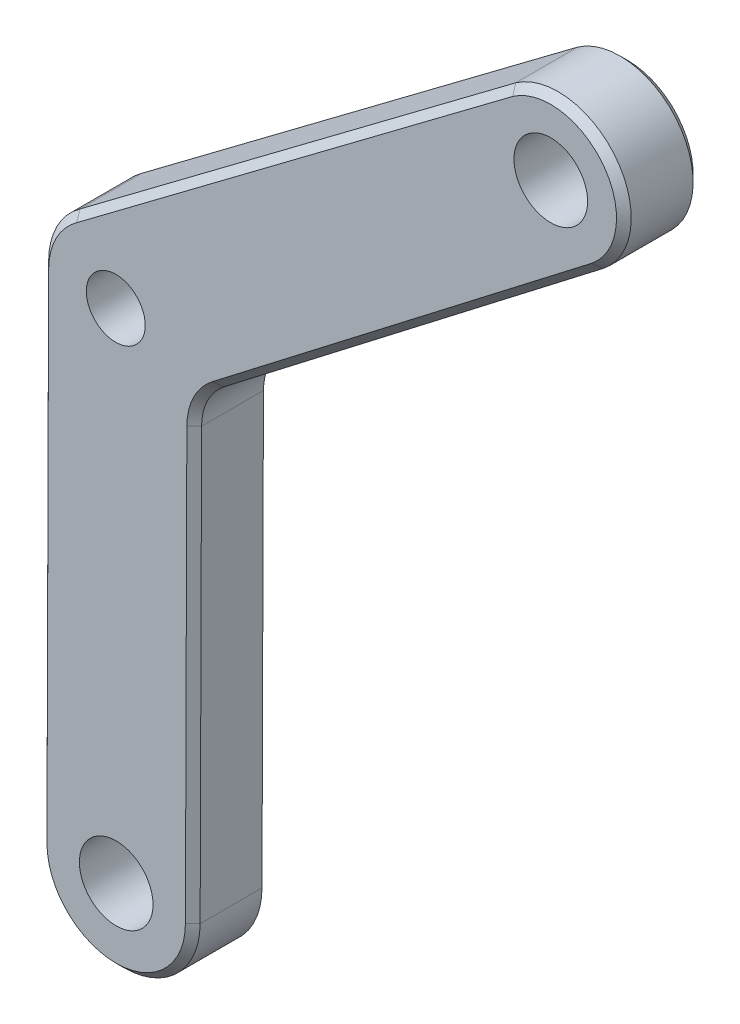
ISO-10303-21;
HEADER;
FILE_DESCRIPTION(('STEP AP214'),'2;1');
FILE_NAME('part.step','',(''),(''),'','','');
FILE_SCHEMA(('AUTOMOTIVE_DESIGN { 1 0 10303 214 1 1 1 1 }'));
ENDSEC;
DATA;
#1=APPLICATION_CONTEXT('core data for automotive mechanical design processes');
#2=APPLICATION_PROTOCOL_DEFINITION('international standard','automotive_design',2000,#1);
#3=PRODUCT_CONTEXT('',#1,'mechanical');
#4=PRODUCT('Part','Part','',(#3));
#5=PRODUCT_RELATED_PRODUCT_CATEGORY('part','',(#4));
#6=PRODUCT_DEFINITION_FORMATION('','',#4);
#7=PRODUCT_DEFINITION_CONTEXT('part definition',#1,'design');
#8=PRODUCT_DEFINITION('design','',#6,#7);
#9=PRODUCT_DEFINITION_SHAPE('','',#8);
#10=(LENGTH_UNIT() NAMED_UNIT(*) SI_UNIT(.MILLI.,.METRE.));
#11=(NAMED_UNIT(*) PLANE_ANGLE_UNIT() SI_UNIT($,.RADIAN.));
#12=(NAMED_UNIT(*) SI_UNIT($,.STERADIAN.) SOLID_ANGLE_UNIT());
#13=UNCERTAINTY_MEASURE_WITH_UNIT(LENGTH_MEASURE(1.E-05),#10,'distance_accuracy_value','');
#14=(GEOMETRIC_REPRESENTATION_CONTEXT(3) GLOBAL_UNCERTAINTY_ASSIGNED_CONTEXT((#13)) GLOBAL_UNIT_ASSIGNED_CONTEXT((#10,
#11,#12)) REPRESENTATION_CONTEXT('',''));
#15=CARTESIAN_POINT('',(0.,0.,0.));
#16=DIRECTION('',(0.,0.,1.));
#17=DIRECTION('',(1.,0.,0.));
#18=AXIS2_PLACEMENT_3D('',#15,#16,#17);
#19=CARTESIAN_POINT('',(22.3710335125583,42.3687079252575,8.3));
#20=DIRECTION('',(0.,0.,-1.));
#21=DIRECTION('',(-1.,0.,0.));
#22=AXIS2_PLACEMENT_3D('',#19,#20,#21);
#23=CYLINDRICAL_SURFACE('',#22,5.05840666229587);
#24=DIRECTION('',(0.,0.,-1.));
#25=VECTOR('',#24,1.);
#26=CARTESIAN_POINT('',(19.4307995829492,46.484835037038,8.3));
#27=LINE('',#26,#25);
#28=CARTESIAN_POINT('',(19.4307995829492,46.484835037038,10.4));
#29=VERTEX_POINT('',#28);
#30=CARTESIAN_POINT('',(19.4307995829492,46.484835037038,6.19999999999999));
#31=VERTEX_POINT('',#30);
#32=EDGE_CURVE('E167',#29,#31,#27,.T.);
#33=ORIENTED_EDGE('',*,*,#32,.T.);
#34=CARTESIAN_POINT('',(22.3710335125583,42.3687079252575,6.19999999999999));
#35=DIRECTION('',(0.,0.,1.));
#36=DIRECTION('',(1.,0.,0.));
#37=AXIS2_PLACEMENT_3D('',#34,#35,#36);
#38=CIRCLE('',#37,5.05840666229587);
#39=CARTESIAN_POINT('',(17.3126566700705,42.3860768786516,6.19999999999999));
#40=VERTEX_POINT('',#39);
#41=EDGE_CURVE('E174',#31,#40,#38,.T.);
#42=ORIENTED_EDGE('',*,*,#41,.T.);
#43=DIRECTION('',(0.,0.,-1.));
#44=VECTOR('',#43,1.);
#45=CARTESIAN_POINT('',(17.3126566700705,42.3860768786516,8.3));
#46=LINE('',#45,#44);
#47=CARTESIAN_POINT('',(17.3126566700705,42.3860768786516,10.4));
#48=VERTEX_POINT('',#47);
#49=EDGE_CURVE('E460',#48,#40,#46,.T.);
#50=ORIENTED_EDGE('',*,*,#49,.F.);
#51=CARTESIAN_POINT('',(22.3710335125583,42.3687079252575,10.4));
#52=DIRECTION('',(0.,0.,1.));
#53=DIRECTION('',(1.,0.,0.));
#54=AXIS2_PLACEMENT_3D('',#51,#52,#53);
#55=CIRCLE('',#54,5.05840666229587);
#56=EDGE_CURVE('E394',#48,#29,#55,.F.);
#57=ORIENTED_EDGE('',*,*,#56,.T.);
#58=EDGE_LOOP('',(#33,#42,#50,#57));
#59=FACE_BOUND('',#58,.T.);
#60=ADVANCED_FACE('F47',(#59),#23,.T.);
#61=CARTESIAN_POINT('',(17.1997578432109,8.5860768786516,8.3));
#62=DIRECTION('',(-0.999994421572052,0.00334018334501582,0.));
#63=DIRECTION('',(-0.00334018334501582,-0.999994421572052,0.));
#64=AXIS2_PLACEMENT_3D('',#61,#62,#63);
#65=PLANE('',#64);
#66=ORIENTED_EDGE('',*,*,#49,.T.);
#67=DIRECTION('',(-0.00334018334501582,-0.999994421572052,0.));
#68=VECTOR('',#67,1.);
#69=CARTESIAN_POINT('',(17.1997578432109,8.5860768786516,6.19999999999999));
#70=LINE('',#69,#68);
#71=CARTESIAN_POINT('',(17.1997578432109,8.5860768786516,6.19999999999999));
#72=VERTEX_POINT('',#71);
#73=EDGE_CURVE('E397',#40,#72,#70,.T.);
#74=ORIENTED_EDGE('',*,*,#73,.T.);
#75=DIRECTION('',(0.,0.,-1.));
#76=VECTOR('',#75,1.);
#77=CARTESIAN_POINT('',(17.1997578432109,8.5860768786516,8.3));
#78=LINE('',#77,#76);
#79=CARTESIAN_POINT('',(17.1997578432109,8.5860768786516,10.4));
#80=VERTEX_POINT('',#79);
#81=EDGE_CURVE('E464',#80,#72,#78,.T.);
#82=ORIENTED_EDGE('',*,*,#81,.F.);
#83=DIRECTION('',(0.00334018334501582,0.999994421572052,0.));
#84=VECTOR('',#83,1.);
#85=CARTESIAN_POINT('',(17.1997578432109,8.5860768786516,10.4));
#86=LINE('',#85,#84);
#87=EDGE_CURVE('E400',#80,#48,#86,.T.);
#88=ORIENTED_EDGE('',*,*,#87,.T.);
#89=EDGE_LOOP('',(#66,#74,#82,#88));
#90=FACE_BOUND('',#89,.T.);
#91=ADVANCED_FACE('F508',(#90),#65,.T.);
#92=CARTESIAN_POINT('',(22.3997288353856,8.56870792525752,8.3));
#93=DIRECTION('',(0.,0.,-1.));
#94=DIRECTION('',(-1.,0.,0.));
#95=AXIS2_PLACEMENT_3D('',#92,#93,#94);
#96=CYLINDRICAL_SURFACE('',#95,5.2);
#97=ORIENTED_EDGE('',*,*,#81,.T.);
#98=CARTESIAN_POINT('',(22.3997288353856,8.56870792525752,6.19999999999999));
#99=DIRECTION('',(0.,0.,1.));
#100=DIRECTION('',(1.,0.,0.));
#101=AXIS2_PLACEMENT_3D('',#98,#99,#100);
#102=CIRCLE('',#101,5.2);
#103=CARTESIAN_POINT('',(27.5996998275603,8.55133897186343,6.19999999999999));
#104=VERTEX_POINT('',#103);
#105=EDGE_CURVE('E403',#72,#104,#102,.T.);
#106=ORIENTED_EDGE('',*,*,#105,.T.);
#107=DIRECTION('',(0.,0.,-1.));
#108=VECTOR('',#107,1.);
#109=CARTESIAN_POINT('',(27.5996998275603,8.55133897186343,8.3));
#110=LINE('',#109,#108);
#111=CARTESIAN_POINT('',(27.5996998275603,8.55133897186343,10.4));
#112=VERTEX_POINT('',#111);
#113=EDGE_CURVE('E468',#112,#104,#110,.T.);
#114=ORIENTED_EDGE('',*,*,#113,.F.);
#115=CARTESIAN_POINT('',(22.3997288353856,8.56870792525752,10.4));
#116=DIRECTION('',(0.,0.,1.));
#117=DIRECTION('',(1.,0.,0.));
#118=AXIS2_PLACEMENT_3D('',#115,#116,#117);
#119=CIRCLE('',#118,5.2);
#120=EDGE_CURVE('E406',#112,#80,#119,.F.);
#121=ORIENTED_EDGE('',*,*,#120,.T.);
#122=EDGE_LOOP('',(#97,#106,#114,#121));
#123=FACE_BOUND('',#122,.T.);
#124=ADVANCED_FACE('F511',(#123),#96,.T.);
#125=CARTESIAN_POINT('',(27.5996998275603,8.55133897186344,8.3));
#126=DIRECTION('',(-0.999994421572052,0.0033401833450153,0.));
#127=DIRECTION('',(-0.0033401833450153,-0.999994421572052,0.));
#128=AXIS2_PLACEMENT_3D('',#125,#126,#127);
#129=PLANE('',#128);
#130=ORIENTED_EDGE('',*,*,#113,.T.);
#131=DIRECTION('',(0.0033401833450153,0.999994421572052,0.));
#132=VECTOR('',#131,1.);
#133=CARTESIAN_POINT('',(27.5996998275603,8.55133897186344,6.19999999999999));
#134=LINE('',#133,#132);
#135=CARTESIAN_POINT('',(27.697556883774,37.8480871492451,6.19999999999999));
#136=VERTEX_POINT('',#135);
#137=EDGE_CURVE('E409',#104,#136,#134,.T.);
#138=ORIENTED_EDGE('',*,*,#137,.T.);
#139=DIRECTION('',(0.,0.,-1.));
#140=VECTOR('',#139,1.);
#141=CARTESIAN_POINT('',(27.697556883774,37.8480871492451,8.3));
#142=LINE('',#141,#140);
#143=CARTESIAN_POINT('',(27.697556883774,37.8480871492451,10.4));
#144=VERTEX_POINT('',#143);
#145=EDGE_CURVE('E197',#136,#144,#142,.F.);
#146=ORIENTED_EDGE('',*,*,#145,.T.);
#147=DIRECTION('',(-0.0033401833450153,-0.999994421572052,0.));
#148=VECTOR('',#147,1.);
#149=CARTESIAN_POINT('',(27.5996998275603,8.55133897186343,10.4));
#150=LINE('',#149,#148);
#151=EDGE_CURVE('E412',#144,#112,#150,.T.);
#152=ORIENTED_EDGE('',*,*,#151,.T.);
#153=EDGE_LOOP('',(#130,#138,#146,#152));
#154=FACE_BOUND('',#153,.T.);
#155=ADVANCED_FACE('F560',(#154),#129,.F.);
#156=CARTESIAN_POINT('',(27.7039388137063,39.7587290727537,8.3));
#157=DIRECTION('',(-0.610243962001282,0.792213548761304,0.));
#158=DIRECTION('',(-0.792213548761304,-0.610243962001282,0.));
#159=AXIS2_PLACEMENT_3D('',#156,#157,#158);
#160=PLANE('',#159);
#161=DIRECTION('',(0.,0.,-1.));
#162=VECTOR('',#161,1.);
#163=CARTESIAN_POINT('',(29.2175836761,40.9246932743687,5.7));
#164=LINE('',#163,#162);
#165=CARTESIAN_POINT('',(29.2175836761,40.9246932743687,10.4));
#166=VERTEX_POINT('',#165);
#167=CARTESIAN_POINT('',(29.2175836761,40.9246932743687,6.19999999999999));
#168=VERTEX_POINT('',#167);
#169=EDGE_CURVE('E456',#166,#168,#164,.T.);
#170=ORIENTED_EDGE('',*,*,#169,.T.);
#171=DIRECTION('',(0.792213548761304,0.610243962001282,0.));
#172=VECTOR('',#171,1.);
#173=CARTESIAN_POINT('',(27.7039388137063,39.7587290727537,6.19999999999999));
#174=LINE('',#173,#172);
#175=CARTESIAN_POINT('',(54.9605801074899,60.7545840413713,6.19999999999999));
#176=VERTEX_POINT('',#175);
#177=EDGE_CURVE('E421',#168,#176,#174,.T.);
#178=ORIENTED_EDGE('',*,*,#177,.T.);
#179=DIRECTION('',(0.,0.,-1.));
#180=VECTOR('',#179,1.);
#181=CARTESIAN_POINT('',(54.9605801074899,60.7545840413713,8.3));
#182=LINE('',#181,#180);
#183=CARTESIAN_POINT('',(54.9605801074899,60.7545840413713,10.4));
#184=VERTEX_POINT('',#183);
#185=EDGE_CURVE('E187',#184,#176,#182,.T.);
#186=ORIENTED_EDGE('',*,*,#185,.F.);
#187=DIRECTION('',(-0.792213548761304,-0.610243962001282,0.));
#188=VECTOR('',#187,1.);
#189=CARTESIAN_POINT('',(29.2175836761,40.9246932743687,10.4));
#190=LINE('',#189,#188);
#191=EDGE_CURVE('E424',#184,#166,#190,.T.);
#192=ORIENTED_EDGE('',*,*,#191,.T.);
#193=EDGE_LOOP('',(#170,#178,#186,#192));
#194=FACE_BOUND('',#193,.T.);
#195=ADVANCED_FACE('F562',(#194),#160,.F.);
#196=CARTESIAN_POINT('',(51.905731419017,64.6640367315511,8.3));
#197=DIRECTION('',(0.,0.,-1.));
#198=DIRECTION('',(-1.,0.,0.));
#199=AXIS2_PLACEMENT_3D('',#196,#197,#198);
#200=CYLINDRICAL_SURFACE('',#199,4.96144342366393);
#201=ORIENTED_EDGE('',*,*,#185,.T.);
#202=CARTESIAN_POINT('',(51.905731419017,64.6640367315511,6.19999999999999));
#203=DIRECTION('',(0.,0.,1.));
#204=DIRECTION('',(1.,0.,0.));
#205=AXIS2_PLACEMENT_3D('',#202,#203,#204);
#206=CIRCLE('',#205,4.96144342366393);
#207=CARTESIAN_POINT('',(49.0247776501373,68.7033468493553,6.19999999999999));
#208=VERTEX_POINT('',#207);
#209=EDGE_CURVE('E185',#176,#208,#206,.T.);
#210=ORIENTED_EDGE('',*,*,#209,.T.);
#211=DIRECTION('',(0.,0.,-1.));
#212=VECTOR('',#211,1.);
#213=CARTESIAN_POINT('',(49.0247776501373,68.7033468493553,8.3));
#214=LINE('',#213,#212);
#215=CARTESIAN_POINT('',(49.0247776501373,68.7033468493553,10.4));
#216=VERTEX_POINT('',#215);
#217=EDGE_CURVE('E165',#216,#208,#214,.T.);
#218=ORIENTED_EDGE('',*,*,#217,.F.);
#219=CARTESIAN_POINT('',(51.905731419017,64.6640367315511,10.4));
#220=DIRECTION('',(0.,0.,1.));
#221=DIRECTION('',(1.,0.,0.));
#222=AXIS2_PLACEMENT_3D('',#219,#220,#221);
#223=CIRCLE('',#222,4.96144342366393);
#224=EDGE_CURVE('E182',#216,#184,#223,.F.);
#225=ORIENTED_EDGE('',*,*,#224,.T.);
#226=EDGE_LOOP('',(#201,#210,#218,#225));
#227=FACE_BOUND('',#226,.T.);
#228=ADVANCED_FACE('F181',(#227),#200,.T.);
#229=CARTESIAN_POINT('',(19.4307995829492,46.484835037038,8.3));
#230=DIRECTION('',(-0.600398184595808,0.799701206660374,0.));
#231=DIRECTION('',(-0.799701206660374,-0.600398184595808,0.));
#232=AXIS2_PLACEMENT_3D('',#229,#230,#231);
#233=PLANE('',#232);
#234=ORIENTED_EDGE('',*,*,#217,.T.);
#235=DIRECTION('',(-0.799701206660374,-0.600398184595808,0.));
#236=VECTOR('',#235,1.);
#237=CARTESIAN_POINT('',(19.4307995829492,46.484835037038,6.19999999999999));
#238=LINE('',#237,#236);
#239=EDGE_CURVE('E173',#208,#31,#238,.T.);
#240=ORIENTED_EDGE('',*,*,#239,.T.);
#241=ORIENTED_EDGE('',*,*,#32,.F.);
#242=DIRECTION('',(0.799701206660374,0.600398184595808,0.));
#243=VECTOR('',#242,1.);
#244=CARTESIAN_POINT('',(19.4307995829492,46.484835037038,10.4));
#245=LINE('',#244,#243);
#246=EDGE_CURVE('E162',#29,#216,#245,.T.);
#247=ORIENTED_EDGE('',*,*,#246,.T.);
#248=EDGE_LOOP('',(#234,#240,#241,#247));
#249=FACE_BOUND('',#248,.T.);
#250=ADVANCED_FACE('F164',(#249),#233,.T.);
#251=CARTESIAN_POINT('',(22.3710335125583,42.3687079252575,10.9));
#252=DIRECTION('',(0.,0.,1.));
#253=DIRECTION('',(1.,0.,0.));
#254=AXIS2_PLACEMENT_3D('',#251,#252,#253);
#255=PLANE('',#254);
#256=DIRECTION('',(0.792213548761304,0.610243962001282,0.));
#257=VECTOR('',#256,1.);
#258=CARTESIAN_POINT('',(54.6554581264893,61.150690815752,10.9));
#259=LINE('',#258,#257);
#260=CARTESIAN_POINT('',(28.9124616950994,41.3208000487493,10.9));
#261=VERTEX_POINT('',#260);
#262=CARTESIAN_POINT('',(54.6540495764378,61.1496058063307,10.9));
#263=VERTEX_POINT('',#262);
#264=EDGE_CURVE('E57',#261,#263,#259,.T.);
#265=ORIENTED_EDGE('',*,*,#264,.T.);
#266=CARTESIAN_POINT('',(51.905731419017,64.6640367315511,10.9));
#267=DIRECTION('',(0.,0.,1.));
#268=DIRECTION('',(1.,0.,0.));
#269=AXIS2_PLACEMENT_3D('',#266,#267,#268);
#270=CIRCLE('',#269,4.46144342366393);
#271=CARTESIAN_POINT('',(49.3199586401439,68.2997287645199,10.9));
#272=VERTEX_POINT('',#271);
#273=EDGE_CURVE('E12',#263,#272,#270,.T.);
#274=ORIENTED_EDGE('',*,*,#273,.T.);
#275=DIRECTION('',(-0.799701206660374,-0.600398184595808,0.));
#276=VECTOR('',#275,1.);
#277=CARTESIAN_POINT('',(19.6350292331419,46.0129326744549,10.9));
#278=LINE('',#277,#276);
#279=CARTESIAN_POINT('',(19.7261315203818,46.0813302802304,10.9));
#280=VERTEX_POINT('',#279);
#281=EDGE_CURVE('E200',#272,#280,#278,.T.);
#282=ORIENTED_EDGE('',*,*,#281,.T.);
#283=CARTESIAN_POINT('',(22.3710335125583,42.3687079252575,10.9));
#284=DIRECTION('',(0.,0.,1.));
#285=DIRECTION('',(1.,0.,0.));
#286=AXIS2_PLACEMENT_3D('',#283,#284,#285);
#287=CIRCLE('',#286,4.55840666229587);
#288=CARTESIAN_POINT('',(17.8126538832817,42.3844067869707,10.9));
#289=VERTEX_POINT('',#288);
#290=EDGE_CURVE('E387',#280,#289,#287,.T.);
#291=ORIENTED_EDGE('',*,*,#290,.T.);
#292=DIRECTION('',(-0.00334018334501582,-0.999994421572051,0.));
#293=VECTOR('',#292,1.);
#294=CARTESIAN_POINT('',(17.8126523011154,42.3839338391969,10.9));
#295=LINE('',#294,#293);
#296=CARTESIAN_POINT('',(17.699755053997,8.58440678697909,10.9));
#297=VERTEX_POINT('',#296);
#298=EDGE_CURVE('E384',#289,#297,#295,.T.);
#299=ORIENTED_EDGE('',*,*,#298,.T.);
#300=CARTESIAN_POINT('',(22.3997288353856,8.56870792525752,10.9));
#301=DIRECTION('',(0.,0.,1.));
#302=DIRECTION('',(1.,0.,0.));
#303=AXIS2_PLACEMENT_3D('',#300,#301,#302);
#304=CIRCLE('',#303,4.7);
#305=CARTESIAN_POINT('',(27.0997026167743,8.55300906353594,10.9));
#306=VERTEX_POINT('',#305);
#307=EDGE_CURVE('E381',#297,#306,#304,.T.);
#308=ORIENTED_EDGE('',*,*,#307,.T.);
#309=DIRECTION('',(0.0033401833450153,0.999994421572051,0.));
#310=VECTOR('',#309,1.);
#311=CARTESIAN_POINT('',(27.197559672988,37.8497572409176,10.9));
#312=LINE('',#311,#310);
#313=CARTESIAN_POINT('',(27.197559672988,37.8497572409176,10.9));
#314=VERTEX_POINT('',#313);
#315=EDGE_CURVE('E378',#306,#314,#312,.T.);
#316=ORIENTED_EDGE('',*,*,#315,.T.);
#317=CARTESIAN_POINT('',(31.597535127905,37.8350604341996,10.9));
#318=DIRECTION('',(0.,0.,1.));
#319=DIRECTION('',(1.,0.,0.));
#320=AXIS2_PLACEMENT_3D('',#317,#318,#319);
#321=CIRCLE('',#320,4.4);
#322=EDGE_CURVE('E68',#314,#261,#321,.F.);
#323=ORIENTED_EDGE('',*,*,#322,.T.);
#324=EDGE_LOOP('',(#265,#274,#282,#291,#299,#308,#316,#323));
#325=FACE_BOUND('',#324,.T.);
#326=CARTESIAN_POINT('',(22.3710335125583,42.3687079252575,10.9));
#327=DIRECTION('',(0.,0.,1.));
#328=DIRECTION('',(1.,0.,0.));
#329=AXIS2_PLACEMENT_3D('',#326,#327,#328);
#330=CIRCLE('',#329,2.);
#331=CARTESIAN_POINT('',(24.3710335125583,42.3687079252575,10.9));
#332=VERTEX_POINT('',#331);
#333=EDGE_CURVE('E51',#332,#332,#330,.T.);
#334=ORIENTED_EDGE('',*,*,#333,.F.);
#335=EDGE_LOOP('',(#334));
#336=FACE_BOUND('',#335,.T.);
#337=CARTESIAN_POINT('',(22.3997288353856,8.56870792525752,10.9));
#338=DIRECTION('',(0.,0.,1.));
#339=DIRECTION('',(1.,0.,0.));
#340=AXIS2_PLACEMENT_3D('',#337,#338,#339);
#341=CIRCLE('',#340,2.5);
#342=CARTESIAN_POINT('',(24.8997288353856,8.56870792525752,10.9));
#343=VERTEX_POINT('',#342);
#344=EDGE_CURVE('E281',#343,#343,#341,.T.);
#345=ORIENTED_EDGE('',*,*,#344,.F.);
#346=EDGE_LOOP('',(#345));
#347=FACE_BOUND('',#346,.T.);
#348=CARTESIAN_POINT('',(51.905731419017,64.6640367315511,10.9));
#349=DIRECTION('',(0.,0.,1.));
#350=DIRECTION('',(1.,0.,0.));
#351=AXIS2_PLACEMENT_3D('',#348,#349,#350);
#352=CIRCLE('',#351,2.50000000000001);
#353=CARTESIAN_POINT('',(54.405731419017,64.6640367315511,10.9));
#354=VERTEX_POINT('',#353);
#355=EDGE_CURVE('E289',#354,#354,#352,.T.);
#356=ORIENTED_EDGE('',*,*,#355,.F.);
#357=EDGE_LOOP('',(#356));
#358=FACE_BOUND('',#357,.T.);
#359=ADVANCED_FACE('F365',(#325,#336,#347,#358),#255,.T.);
#360=CARTESIAN_POINT('',(22.3710335125583,42.3687079252575,5.7));
#361=DIRECTION('',(0.,0.,1.));
#362=DIRECTION('',(1.,0.,0.));
#363=AXIS2_PLACEMENT_3D('',#360,#361,#362);
#364=PLANE('',#363);
#365=DIRECTION('',(0.799701206660374,0.600398184595808,0.));
#366=VECTOR('',#365,1.);
#367=CARTESIAN_POINT('',(49.3249767424352,68.3034962460251,5.7));
#368=LINE('',#367,#366);
#369=CARTESIAN_POINT('',(19.7261315203821,46.0813302802306,5.7));
#370=VERTEX_POINT('',#369);
#371=CARTESIAN_POINT('',(49.319958640144,68.29972876452,5.7));
#372=VERTEX_POINT('',#371);
#373=EDGE_CURVE('E449',#370,#372,#368,.T.);
#374=ORIENTED_EDGE('',*,*,#373,.T.);
#375=CARTESIAN_POINT('',(51.905731419017,64.6640367315511,5.7));
#376=DIRECTION('',(0.,0.,1.));
#377=DIRECTION('',(1.,0.,0.));
#378=AXIS2_PLACEMENT_3D('',#375,#376,#377);
#379=CIRCLE('',#378,4.46144342366394);
#380=CARTESIAN_POINT('',(54.654049576438,61.1496058063308,5.7));
#381=VERTEX_POINT('',#380);
#382=EDGE_CURVE('E427',#372,#381,#379,.F.);
#383=ORIENTED_EDGE('',*,*,#382,.T.);
#384=DIRECTION('',(-0.792213548761304,-0.610243962001282,0.));
#385=VECTOR('',#384,1.);
#386=CARTESIAN_POINT('',(25.3136505656106,38.5486273617415,5.7));
#387=LINE('',#386,#385);
#388=CARTESIAN_POINT('',(28.9124616950994,41.3208000487493,5.7));
#389=VERTEX_POINT('',#388);
#390=EDGE_CURVE('E431',#381,#389,#387,.T.);
#391=ORIENTED_EDGE('',*,*,#390,.T.);
#392=CARTESIAN_POINT('',(31.597535127905,37.8350604341996,5.7));
#393=DIRECTION('',(0.,0.,1.));
#394=DIRECTION('',(1.,0.,0.));
#395=AXIS2_PLACEMENT_3D('',#392,#393,#394);
#396=CIRCLE('',#395,4.39999999999998);
#397=CARTESIAN_POINT('',(27.197559672988,37.8497572409176,5.7));
#398=VERTEX_POINT('',#397);
#399=EDGE_CURVE('E434',#389,#398,#396,.T.);
#400=ORIENTED_EDGE('',*,*,#399,.T.);
#401=DIRECTION('',(-0.0033401833450153,-0.999994421572051,0.));
#402=VECTOR('',#401,1.);
#403=CARTESIAN_POINT('',(27.2125998638926,42.3525361157537,5.7));
#404=LINE('',#403,#402);
#405=CARTESIAN_POINT('',(27.0997026167743,8.55300906353594,5.7));
#406=VERTEX_POINT('',#405);
#407=EDGE_CURVE('E437',#398,#406,#404,.T.);
#408=ORIENTED_EDGE('',*,*,#407,.T.);
#409=CARTESIAN_POINT('',(22.3997288353856,8.56870792525752,5.7));
#410=DIRECTION('',(0.,0.,1.));
#411=DIRECTION('',(1.,0.,0.));
#412=AXIS2_PLACEMENT_3D('',#409,#410,#411);
#413=CIRCLE('',#412,4.70000000000001);
#414=CARTESIAN_POINT('',(17.699755053997,8.58440678697909,5.7));
#415=VERTEX_POINT('',#414);
#416=EDGE_CURVE('E440',#406,#415,#413,.F.);
#417=ORIENTED_EDGE('',*,*,#416,.T.);
#418=DIRECTION('',(0.00334018334501582,0.999994421572051,0.));
#419=VECTOR('',#418,1.);
#420=CARTESIAN_POINT('',(17.8126538808565,42.3844067869791,5.7));
#421=LINE('',#420,#419);
#422=CARTESIAN_POINT('',(17.8126538832816,42.3844067869707,5.7));
#423=VERTEX_POINT('',#422);
#424=EDGE_CURVE('E443',#415,#423,#421,.T.);
#425=ORIENTED_EDGE('',*,*,#424,.T.);
#426=CARTESIAN_POINT('',(22.3710335125583,42.3687079252575,5.7));
#427=DIRECTION('',(0.,0.,1.));
#428=DIRECTION('',(1.,0.,0.));
#429=AXIS2_PLACEMENT_3D('',#426,#427,#428);
#430=CIRCLE('',#429,4.55840666229589);
#431=EDGE_CURVE('E446',#423,#370,#430,.F.);
#432=ORIENTED_EDGE('',*,*,#431,.T.);
#433=EDGE_LOOP('',(#374,#383,#391,#400,#408,#417,#425,#432));
#434=FACE_BOUND('',#433,.T.);
#435=CARTESIAN_POINT('',(22.3710335125583,42.3687079252575,5.7));
#436=DIRECTION('',(0.,0.,1.));
#437=DIRECTION('',(1.,0.,0.));
#438=AXIS2_PLACEMENT_3D('',#435,#436,#437);
#439=CIRCLE('',#438,2.);
#440=CARTESIAN_POINT('',(24.3710335125583,42.3687079252575,5.7));
#441=VERTEX_POINT('',#440);
#442=EDGE_CURVE('E292',#441,#441,#439,.T.);
#443=ORIENTED_EDGE('',*,*,#442,.T.);
#444=EDGE_LOOP('',(#443));
#445=FACE_BOUND('',#444,.T.);
#446=CARTESIAN_POINT('',(22.3997288353856,8.56870792525752,5.7));
#447=DIRECTION('',(0.,0.,1.));
#448=DIRECTION('',(1.,0.,0.));
#449=AXIS2_PLACEMENT_3D('',#446,#447,#448);
#450=CIRCLE('',#449,2.5);
#451=CARTESIAN_POINT('',(24.8997288353856,8.56870792525752,5.7));
#452=VERTEX_POINT('',#451);
#453=EDGE_CURVE('E277',#452,#452,#450,.T.);
#454=ORIENTED_EDGE('',*,*,#453,.T.);
#455=EDGE_LOOP('',(#454));
#456=FACE_BOUND('',#455,.T.);
#457=CARTESIAN_POINT('',(51.905731419017,64.6640367315511,5.7));
#458=DIRECTION('',(0.,0.,1.));
#459=DIRECTION('',(1.,0.,0.));
#460=AXIS2_PLACEMENT_3D('',#457,#458,#459);
#461=CIRCLE('',#460,2.50000000000001);
#462=CARTESIAN_POINT('',(54.405731419017,64.6640367315511,5.7));
#463=VERTEX_POINT('',#462);
#464=EDGE_CURVE('E285',#463,#463,#461,.T.);
#465=ORIENTED_EDGE('',*,*,#464,.T.);
#466=EDGE_LOOP('',(#465));
#467=FACE_BOUND('',#466,.T.);
#468=ADVANCED_FACE('F488',(#434,#445,#456,#467),#364,.F.);
#469=CARTESIAN_POINT('',(31.597535127905,37.8350604341996,8.3));
#470=DIRECTION('',(0.,0.,1.));
#471=DIRECTION('',(1.,0.,0.));
#472=AXIS2_PLACEMENT_3D('',#469,#470,#471);
#473=CYLINDRICAL_SURFACE('',#472,3.9);
#474=ORIENTED_EDGE('',*,*,#145,.F.);
#475=CARTESIAN_POINT('',(31.597535127905,37.8350604341996,6.19999999999999));
#476=DIRECTION('',(0.,0.,1.));
#477=DIRECTION('',(1.,0.,0.));
#478=AXIS2_PLACEMENT_3D('',#475,#476,#477);
#479=CIRCLE('',#478,3.9);
#480=EDGE_CURVE('E415',#136,#168,#479,.F.);
#481=ORIENTED_EDGE('',*,*,#480,.T.);
#482=ORIENTED_EDGE('',*,*,#169,.F.);
#483=CARTESIAN_POINT('',(31.597535127905,37.8350604341996,10.4));
#484=DIRECTION('',(0.,0.,1.));
#485=DIRECTION('',(1.,0.,0.));
#486=AXIS2_PLACEMENT_3D('',#483,#484,#485);
#487=CIRCLE('',#486,3.9);
#488=EDGE_CURVE('E418',#166,#144,#487,.T.);
#489=ORIENTED_EDGE('',*,*,#488,.T.);
#490=EDGE_LOOP('',(#474,#481,#482,#489));
#491=FACE_BOUND('',#490,.T.);
#492=ADVANCED_FACE('F545',(#491),#473,.F.);
#493=CARTESIAN_POINT('',(51.905731419017,64.6640367315511,5.7));
#494=DIRECTION('',(0.,0.,1.));
#495=DIRECTION('',(1.,0.,0.));
#496=AXIS2_PLACEMENT_3D('',#493,#494,#495);
#497=CYLINDRICAL_SURFACE('',#496,2.50000000000001);
#498=ORIENTED_EDGE('',*,*,#464,.F.);
#499=EDGE_LOOP('',(#498));
#500=FACE_BOUND('',#499,.T.);
#501=ORIENTED_EDGE('',*,*,#355,.T.);
#502=EDGE_LOOP('',(#501));
#503=FACE_BOUND('',#502,.T.);
#504=ADVANCED_FACE('F547',(#500,#503),#497,.F.);
#505=CARTESIAN_POINT('',(22.3997288353856,8.56870792525752,5.7));
#506=DIRECTION('',(0.,0.,1.));
#507=DIRECTION('',(1.,0.,0.));
#508=AXIS2_PLACEMENT_3D('',#505,#506,#507);
#509=CYLINDRICAL_SURFACE('',#508,2.5);
#510=ORIENTED_EDGE('',*,*,#453,.F.);
#511=EDGE_LOOP('',(#510));
#512=FACE_BOUND('',#511,.T.);
#513=ORIENTED_EDGE('',*,*,#344,.T.);
#514=EDGE_LOOP('',(#513));
#515=FACE_BOUND('',#514,.T.);
#516=ADVANCED_FACE('F553',(#512,#515),#509,.F.);
#517=CARTESIAN_POINT('',(22.3710335125583,42.3687079252575,5.7));
#518=DIRECTION('',(0.,0.,1.));
#519=DIRECTION('',(1.,0.,0.));
#520=AXIS2_PLACEMENT_3D('',#517,#518,#519);
#521=CYLINDRICAL_SURFACE('',#520,2.);
#522=ORIENTED_EDGE('',*,*,#442,.F.);
#523=EDGE_LOOP('',(#522));
#524=FACE_BOUND('',#523,.T.);
#525=ORIENTED_EDGE('',*,*,#333,.T.);
#526=EDGE_LOOP('',(#525));
#527=FACE_BOUND('',#526,.T.);
#528=ADVANCED_FACE('F49',(#524,#527),#521,.F.);
#529=CARTESIAN_POINT('',(22.3997288353856,8.56870792525752,6.19999999999999));
#530=DIRECTION('',(0.,0.,1.));
#531=DIRECTION('',(1.,0.,0.));
#532=AXIS2_PLACEMENT_3D('',#529,#530,#531);
#533=CONICAL_SURFACE('',#532,5.2,0.785398163397447);
#534=DIRECTION('',(-0.707102836642317,0.00236186629366566,0.707106781186548));
#535=VECTOR('',#534,1.);
#536=CARTESIAN_POINT('',(17.699755053997,8.58440678697909,5.7));
#537=LINE('',#536,#535);
#538=EDGE_CURVE('E306',#415,#72,#537,.T.);
#539=ORIENTED_EDGE('',*,*,#538,.F.);
#540=ORIENTED_EDGE('',*,*,#416,.F.);
#541=DIRECTION('',(-0.707102836642317,0.00236186629366566,-0.707106781186548));
#542=VECTOR('',#541,1.);
#543=CARTESIAN_POINT('',(27.5996998275603,8.55133897186343,6.19999999999999));
#544=LINE('',#543,#542);
#545=EDGE_CURVE('E214',#104,#406,#544,.T.);
#546=ORIENTED_EDGE('',*,*,#545,.F.);
#547=ORIENTED_EDGE('',*,*,#105,.F.);
#548=EDGE_LOOP('',(#539,#540,#546,#547));
#549=FACE_BOUND('',#548,.T.);
#550=ADVANCED_FACE('F503',(#549),#533,.T.);
#551=CARTESIAN_POINT('',(27.5996998275603,8.55133897186344,6.19999999999999));
#552=DIRECTION('',(-0.707102836642318,0.00236186629366668,0.707106781186547));
#553=DIRECTION('',(0.0033401833450153,0.999994421572052,0.));
#554=AXIS2_PLACEMENT_3D('',#551,#552,#553);
#555=PLANE('',#554);
#556=ORIENTED_EDGE('',*,*,#545,.T.);
#557=ORIENTED_EDGE('',*,*,#407,.F.);
#558=DIRECTION('',(-0.707102836642317,0.00236186629366321,-0.707106781186548));
#559=VECTOR('',#558,1.);
#560=CARTESIAN_POINT('',(27.697556883774,37.8480871492451,6.19999999999999));
#561=LINE('',#560,#559);
#562=EDGE_CURVE('E313',#136,#398,#561,.T.);
#563=ORIENTED_EDGE('',*,*,#562,.F.);
#564=ORIENTED_EDGE('',*,*,#137,.F.);
#565=EDGE_LOOP('',(#556,#557,#563,#564));
#566=FACE_BOUND('',#565,.T.);
#567=ADVANCED_FACE('F500',(#566),#555,.F.);
#568=CARTESIAN_POINT('',(17.8126523011153,42.3839338391969,5.7));
#569=DIRECTION('',(-0.707102836642318,0.00236186629366705,-0.707106781186546));
#570=DIRECTION('',(-0.00334018334501582,-0.999994421572052,0.));
#571=AXIS2_PLACEMENT_3D('',#568,#569,#570);
#572=PLANE('',#571);
#573=ORIENTED_EDGE('',*,*,#538,.T.);
#574=ORIENTED_EDGE('',*,*,#73,.F.);
#575=DIRECTION('',(-0.707102836642317,0.00236186629366321,0.707106781186548));
#576=VECTOR('',#575,1.);
#577=CARTESIAN_POINT('',(17.8126538808565,42.3844067869791,5.7));
#578=LINE('',#577,#576);
#579=EDGE_CURVE('E321',#423,#40,#578,.T.);
#580=ORIENTED_EDGE('',*,*,#579,.F.);
#581=ORIENTED_EDGE('',*,*,#424,.F.);
#582=EDGE_LOOP('',(#573,#574,#580,#581));
#583=FACE_BOUND('',#582,.T.);
#584=ADVANCED_FACE('F505',(#583),#572,.T.);
#585=CARTESIAN_POINT('',(31.597535127905,37.8350604341996,5.7));
#586=DIRECTION('',(0.,0.,-1.));
#587=DIRECTION('',(-1.,0.,0.));
#588=AXIS2_PLACEMENT_3D('',#585,#586,#587);
#589=CONICAL_SURFACE('',#588,4.39999999999999,0.785398163397448);
#590=ORIENTED_EDGE('',*,*,#562,.T.);
#591=ORIENTED_EDGE('',*,*,#399,.F.);
#592=DIRECTION('',(-0.431507643709252,0.560179572476979,-0.707106781186546));
#593=VECTOR('',#592,1.);
#594=CARTESIAN_POINT('',(29.2175836761,40.9246932743687,6.19999999999999));
#595=LINE('',#594,#593);
#596=EDGE_CURVE('E327',#168,#389,#595,.T.);
#597=ORIENTED_EDGE('',*,*,#596,.F.);
#598=ORIENTED_EDGE('',*,*,#480,.F.);
#599=EDGE_LOOP('',(#590,#591,#597,#598));
#600=FACE_BOUND('',#599,.T.);
#601=ADVANCED_FACE('F497',(#600),#589,.F.);
#602=CARTESIAN_POINT('',(22.3710335125583,42.3687079252575,6.19999999999999));
#603=DIRECTION('',(0.,0.,1.));
#604=DIRECTION('',(1.,0.,0.));
#605=AXIS2_PLACEMENT_3D('',#602,#603,#604);
#606=CONICAL_SURFACE('',#605,5.05840666229587,0.785398163397447);
#607=ORIENTED_EDGE('',*,*,#579,.T.);
#608=ORIENTED_EDGE('',*,*,#41,.F.);
#609=CARTESIAN_POINT('',(19.7261315203821,46.0813302802306,5.7));
#610=CARTESIAN_POINT('',(19.6769307309148,46.1485967888349,5.7833331727755));
#611=CARTESIAN_POINT('',(19.627719341379,46.2158554395595,5.86666642585707));
#612=CARTESIAN_POINT('',(19.5292753622347,46.3503570251619,6.03333309252373));
#613=CARTESIAN_POINT('',(19.4800427726261,46.4175999600397,6.11666650610882));
#614=CARTESIAN_POINT('',(19.430799582949,46.4848350370379,6.19999999999999));
#615=B_SPLINE_CURVE_WITH_KNOTS('',3,(#609,#610,#611,#612,#613,#614),.UNSPECIFIED.,.F.,.F.,(4,2,
4),(0.,0.353566489133934,0.707132977807006),.UNSPECIFIED.);
#616=EDGE_CURVE('E331',#370,#31,#615,.T.);
#617=ORIENTED_EDGE('',*,*,#616,.F.);
#618=ORIENTED_EDGE('',*,*,#431,.F.);
#619=EDGE_LOOP('',(#607,#608,#617,#618));
#620=FACE_BOUND('',#619,.T.);
#621=ADVANCED_FACE('F350',(#620),#606,.T.);
#622=CARTESIAN_POINT('',(27.7039388137063,39.7587290727537,6.19999999999999));
#623=DIRECTION('',(-0.431507643709252,0.560179572476977,0.707106781186548));
#624=DIRECTION('',(0.792213548761304,0.610243962001282,0.));
#625=AXIS2_PLACEMENT_3D('',#622,#623,#624);
#626=PLANE('',#625);
#627=ORIENTED_EDGE('',*,*,#596,.T.);
#628=ORIENTED_EDGE('',*,*,#390,.F.);
#629=CARTESIAN_POINT('',(54.654049576438,61.1496058063308,5.7));
#630=CARTESIAN_POINT('',(54.7051442225843,61.0837736577519,5.78333331934968));
#631=CARTESIAN_POINT('',(54.75623575658,61.0179391030472,5.86666664569365));
#632=CARTESIAN_POINT('',(54.8584126002639,60.886265181394,6.03333331236031));
#633=CARTESIAN_POINT('',(54.909497909952,60.8204258144454,6.11666665268301));
#634=CARTESIAN_POINT('',(54.9605801074895,60.754584041371,6.19999999999999));
#635=B_SPLINE_CURVE_WITH_KNOTS('',3,(#629,#630,#631,#632,#633,#634),.UNSPECIFIED.,.F.,.F.,(4,2,
4),(0.,0.353554508483095,0.707109016924379),.UNSPECIFIED.);
#636=EDGE_CURVE('E341',#176,#381,#635,.F.);
#637=ORIENTED_EDGE('',*,*,#636,.F.);
#638=ORIENTED_EDGE('',*,*,#177,.F.);
#639=EDGE_LOOP('',(#627,#628,#637,#638));
#640=FACE_BOUND('',#639,.T.);
#641=ADVANCED_FACE('F363',(#640),#626,.F.);
#642=CARTESIAN_POINT('',(19.6350292331419,46.0129326744549,5.7));
#643=DIRECTION('',(-0.424545627739788,0.565474146152614,-0.707106781186548));
#644=DIRECTION('',(-0.799701206660374,-0.600398184595808,0.));
#645=AXIS2_PLACEMENT_3D('',#642,#643,#644);
#646=PLANE('',#645);
#647=ORIENTED_EDGE('',*,*,#616,.T.);
#648=ORIENTED_EDGE('',*,*,#239,.F.);
#649=CARTESIAN_POINT('',(49.0247776501373,68.7033468493553,6.19999999999999));
#650=CARTESIAN_POINT('',(49.0739967931134,68.636093701577,6.11666649247973));
#651=CARTESIAN_POINT('',(49.1232047804172,68.5688322873096,6.03333307208363));
#652=CARTESIAN_POINT('',(49.2215984437528,68.4342929256979,5.86666640541697));
#653=CARTESIAN_POINT('',(49.2707841197845,68.3670149783534,5.78333315914641));
#654=CARTESIAN_POINT('',(49.3199586401439,68.2997287645199,5.7));
#655=B_SPLINE_CURVE_WITH_KNOTS('',3,(#649,#650,#651,#652,#653,#654),.UNSPECIFIED.,.F.,.F.,(4,2,
4),(0.,0.353567313771865,0.707134628064535),.UNSPECIFIED.);
#656=EDGE_CURVE('E276',#372,#208,#655,.F.);
#657=ORIENTED_EDGE('',*,*,#656,.F.);
#658=ORIENTED_EDGE('',*,*,#373,.F.);
#659=EDGE_LOOP('',(#647,#648,#657,#658));
#660=FACE_BOUND('',#659,.T.);
#661=ADVANCED_FACE('F354',(#660),#646,.T.);
#662=CARTESIAN_POINT('',(51.905731419017,64.6640367315511,6.19999999999999));
#663=DIRECTION('',(0.,0.,1.));
#664=DIRECTION('',(1.,0.,0.));
#665=AXIS2_PLACEMENT_3D('',#662,#663,#664);
#666=CONICAL_SURFACE('',#665,4.96144342366393,0.785398163397452);
#667=ORIENTED_EDGE('',*,*,#636,.T.);
#668=ORIENTED_EDGE('',*,*,#382,.F.);
#669=ORIENTED_EDGE('',*,*,#656,.T.);
#670=ORIENTED_EDGE('',*,*,#209,.F.);
#671=EDGE_LOOP('',(#667,#668,#669,#670));
#672=FACE_BOUND('',#671,.T.);
#673=ADVANCED_FACE('F362',(#672),#666,.T.);
#674=CARTESIAN_POINT('',(22.3997288353856,8.56870792525752,10.9));
#675=DIRECTION('',(0.,0.,-1.));
#676=DIRECTION('',(-1.,0.,0.));
#677=AXIS2_PLACEMENT_3D('',#674,#675,#676);
#678=CONICAL_SURFACE('',#677,4.7,0.785398163397447);
#679=DIRECTION('',(0.707102836642317,-0.0023618662936656,0.707106781186548));
#680=VECTOR('',#679,1.);
#681=CARTESIAN_POINT('',(17.199757843211,8.5860768786516,10.4));
#682=LINE('',#681,#680);
#683=EDGE_CURVE('E268',#80,#297,#682,.T.);
#684=ORIENTED_EDGE('',*,*,#683,.F.);
#685=ORIENTED_EDGE('',*,*,#120,.F.);
#686=DIRECTION('',(0.707102836642317,-0.0023618662936656,-0.707106781186548));
#687=VECTOR('',#686,1.);
#688=CARTESIAN_POINT('',(27.0997026167743,8.55300906353594,10.9));
#689=LINE('',#688,#687);
#690=EDGE_CURVE('E272',#306,#112,#689,.T.);
#691=ORIENTED_EDGE('',*,*,#690,.F.);
#692=ORIENTED_EDGE('',*,*,#307,.F.);
#693=EDGE_LOOP('',(#684,#685,#691,#692));
#694=FACE_BOUND('',#693,.T.);
#695=ADVANCED_FACE('F516',(#694),#678,.T.);
#696=CARTESIAN_POINT('',(27.2125998638926,42.3525361157537,10.9));
#697=DIRECTION('',(0.707102836642318,-0.00236186629366668,0.707106781186547));
#698=DIRECTION('',(-0.0033401833450153,-0.999994421572052,0.));
#699=AXIS2_PLACEMENT_3D('',#696,#697,#698);
#700=PLANE('',#699);
#701=ORIENTED_EDGE('',*,*,#690,.T.);
#702=ORIENTED_EDGE('',*,*,#151,.F.);
#703=DIRECTION('',(0.707102836642317,-0.00236186629366314,-0.707106781186548));
#704=VECTOR('',#703,1.);
#705=CARTESIAN_POINT('',(27.197559672988,37.8497572409176,10.9));
#706=LINE('',#705,#704);
#707=EDGE_CURVE('E264',#314,#144,#706,.T.);
#708=ORIENTED_EDGE('',*,*,#707,.F.);
#709=ORIENTED_EDGE('',*,*,#315,.F.);
#710=EDGE_LOOP('',(#701,#702,#708,#709));
#711=FACE_BOUND('',#710,.T.);
#712=ADVANCED_FACE('F522',(#711),#700,.T.);
#713=CARTESIAN_POINT('',(17.1997578432109,8.5860768786516,10.4));
#714=DIRECTION('',(0.707102836642318,-0.00236186629366705,-0.707106781186546));
#715=DIRECTION('',(0.00334018334501582,0.999994421572052,0.));
#716=AXIS2_PLACEMENT_3D('',#713,#714,#715);
#717=PLANE('',#716);
#718=ORIENTED_EDGE('',*,*,#683,.T.);
#719=ORIENTED_EDGE('',*,*,#298,.F.);
#720=DIRECTION('',(0.707102836642314,-0.00236186629366315,0.70710678118655));
#721=VECTOR('',#720,1.);
#722=CARTESIAN_POINT('',(17.3126566700705,42.3860768786516,10.4));
#723=LINE('',#722,#721);
#724=EDGE_CURVE('E260',#48,#289,#723,.T.);
#725=ORIENTED_EDGE('',*,*,#724,.F.);
#726=ORIENTED_EDGE('',*,*,#87,.F.);
#727=EDGE_LOOP('',(#718,#719,#725,#726));
#728=FACE_BOUND('',#727,.T.);
#729=ADVANCED_FACE('F527',(#728),#717,.F.);
#730=CARTESIAN_POINT('',(31.597535127905,37.8350604341996,10.9));
#731=DIRECTION('',(0.,0.,1.));
#732=DIRECTION('',(1.,0.,0.));
#733=AXIS2_PLACEMENT_3D('',#730,#731,#732);
#734=CONICAL_SURFACE('',#733,4.4,0.785398163397444);
#735=ORIENTED_EDGE('',*,*,#707,.T.);
#736=ORIENTED_EDGE('',*,*,#488,.F.);
#737=DIRECTION('',(0.431507643709252,-0.560179572476976,-0.707106781186549));
#738=VECTOR('',#737,1.);
#739=CARTESIAN_POINT('',(28.9124616950994,41.3208000487493,10.9));
#740=LINE('',#739,#738);
#741=EDGE_CURVE('E256',#261,#166,#740,.T.);
#742=ORIENTED_EDGE('',*,*,#741,.F.);
#743=ORIENTED_EDGE('',*,*,#322,.F.);
#744=EDGE_LOOP('',(#735,#736,#742,#743));
#745=FACE_BOUND('',#744,.T.);
#746=ADVANCED_FACE('F247',(#745),#734,.F.);
#747=CARTESIAN_POINT('',(22.3710335125583,42.3687079252575,10.9));
#748=DIRECTION('',(0.,0.,-1.));
#749=DIRECTION('',(-1.,0.,0.));
#750=AXIS2_PLACEMENT_3D('',#747,#748,#749);
#751=CONICAL_SURFACE('',#750,4.55840666229587,0.785398163397447);
#752=ORIENTED_EDGE('',*,*,#724,.T.);
#753=ORIENTED_EDGE('',*,*,#290,.F.);
#754=CARTESIAN_POINT('',(19.4307995829492,46.484835037038,10.4));
#755=CARTESIAN_POINT('',(19.4800427726262,46.4175999600398,10.4833334938912));
#756=CARTESIAN_POINT('',(19.5292753622347,46.3503570251619,10.5666669074763));
#757=CARTESIAN_POINT('',(19.6277193413789,46.2158554395594,10.7333335741429));
#758=CARTESIAN_POINT('',(19.6769307309146,46.1485967888347,10.8166668272245));
#759=CARTESIAN_POINT('',(19.7261315203818,46.0813302802304,10.9));
#760=B_SPLINE_CURVE_WITH_KNOTS('',3,(#754,#755,#756,#757,#758,#759),.UNSPECIFIED.,.F.,.F.,(4,2,
4),(0.,0.35356648867308,0.707132977807028),.UNSPECIFIED.);
#761=EDGE_CURVE('E205',#29,#280,#760,.T.);
#762=ORIENTED_EDGE('',*,*,#761,.F.);
#763=ORIENTED_EDGE('',*,*,#56,.F.);
#764=EDGE_LOOP('',(#752,#753,#762,#763));
#765=FACE_BOUND('',#764,.T.);
#766=ADVANCED_FACE('F239',(#765),#751,.T.);
#767=CARTESIAN_POINT('',(25.3136505656106,38.5486273617416,10.9));
#768=DIRECTION('',(0.431507643709252,-0.560179572476977,0.707106781186549));
#769=DIRECTION('',(-0.792213548761304,-0.610243962001282,0.));
#770=AXIS2_PLACEMENT_3D('',#767,#768,#769);
#771=PLANE('',#770);
#772=ORIENTED_EDGE('',*,*,#741,.T.);
#773=ORIENTED_EDGE('',*,*,#191,.F.);
#774=CARTESIAN_POINT('',(54.9605801074899,60.7545840413714,10.4));
#775=CARTESIAN_POINT('',(54.9094979099522,60.8204258144455,10.483333347317));
#776=CARTESIAN_POINT('',(54.8584126002638,60.886265181394,10.5666666876397));
#777=CARTESIAN_POINT('',(54.7562357565798,61.0179391030471,10.7333333543063));
#778=CARTESIAN_POINT('',(54.7051442225841,61.0837736577517,10.8166666806503));
#779=CARTESIAN_POINT('',(54.6540495764377,61.1496058063306,10.9));
#780=B_SPLINE_CURVE_WITH_KNOTS('',3,(#774,#775,#776,#777,#778,#779),.UNSPECIFIED.,.F.,.F.,(4,2,
4),(0.,0.35355450844129,0.707109016924394),.UNSPECIFIED.);
#781=EDGE_CURVE('E194',#263,#184,#780,.F.);
#782=ORIENTED_EDGE('',*,*,#781,.F.);
#783=ORIENTED_EDGE('',*,*,#264,.F.);
#784=EDGE_LOOP('',(#772,#773,#782,#783));
#785=FACE_BOUND('',#784,.T.);
#786=ADVANCED_FACE('F231',(#785),#771,.T.);
#787=CARTESIAN_POINT('',(19.4307995829492,46.484835037038,10.4));
#788=DIRECTION('',(0.42454562773979,-0.565474146152617,-0.707106781186545));
#789=DIRECTION('',(0.799701206660374,0.600398184595808,0.));
#790=AXIS2_PLACEMENT_3D('',#787,#788,#789);
#791=PLANE('',#790);
#792=ORIENTED_EDGE('',*,*,#761,.T.);
#793=ORIENTED_EDGE('',*,*,#281,.F.);
#794=CARTESIAN_POINT('',(49.3199586401439,68.2997287645199,10.9));
#795=CARTESIAN_POINT('',(49.2707841197844,68.3670149783533,10.8166668408536));
#796=CARTESIAN_POINT('',(49.2215984437527,68.4342929256978,10.733333594583));
#797=CARTESIAN_POINT('',(49.1232047804172,68.5688322873096,10.5666669279164));
#798=CARTESIAN_POINT('',(49.0739967931135,68.6360937015771,10.4833335075203));
#799=CARTESIAN_POINT('',(49.0247776501376,68.7033468493555,10.4));
#800=B_SPLINE_CURVE_WITH_KNOTS('',3,(#794,#795,#796,#797,#798,#799),.UNSPECIFIED.,.F.,.F.,(4,2,
4),(0.,0.353567314292674,0.707134628064548),.UNSPECIFIED.);
#801=EDGE_CURVE('E192',#216,#272,#800,.F.);
#802=ORIENTED_EDGE('',*,*,#801,.F.);
#803=ORIENTED_EDGE('',*,*,#246,.F.);
#804=EDGE_LOOP('',(#792,#793,#802,#803));
#805=FACE_BOUND('',#804,.T.);
#806=ADVANCED_FACE('F199',(#805),#791,.F.);
#807=CARTESIAN_POINT('',(51.905731419017,64.6640367315511,10.9));
#808=DIRECTION('',(0.,0.,-1.));
#809=DIRECTION('',(-1.,0.,0.));
#810=AXIS2_PLACEMENT_3D('',#807,#808,#809);
#811=CONICAL_SURFACE('',#810,4.46144342366393,0.785398163397449);
#812=ORIENTED_EDGE('',*,*,#781,.T.);
#813=ORIENTED_EDGE('',*,*,#224,.F.);
#814=ORIENTED_EDGE('',*,*,#801,.T.);
#815=ORIENTED_EDGE('',*,*,#273,.F.);
#816=EDGE_LOOP('',(#812,#813,#814,#815));
#817=FACE_BOUND('',#816,.T.);
#818=ADVANCED_FACE('F190',(#817),#811,.T.);
#819=CLOSED_SHELL('',(#60,#91,#124,#155,#195,#228,#250,#359,#468,#492,#504,#516,#528,#550,#567,
#584,#601,#621,#641,#661,#673,#695,#712,#729,#746,#766,#786,#806,#818));
#820=MANIFOLD_SOLID_BREP('B2',#819);
#821=ADVANCED_BREP_SHAPE_REPRESENTATION('',(#18,#820),#14);
#822=SHAPE_DEFINITION_REPRESENTATION(#9,#821);
ENDSEC;
END-ISO-10303-21;
